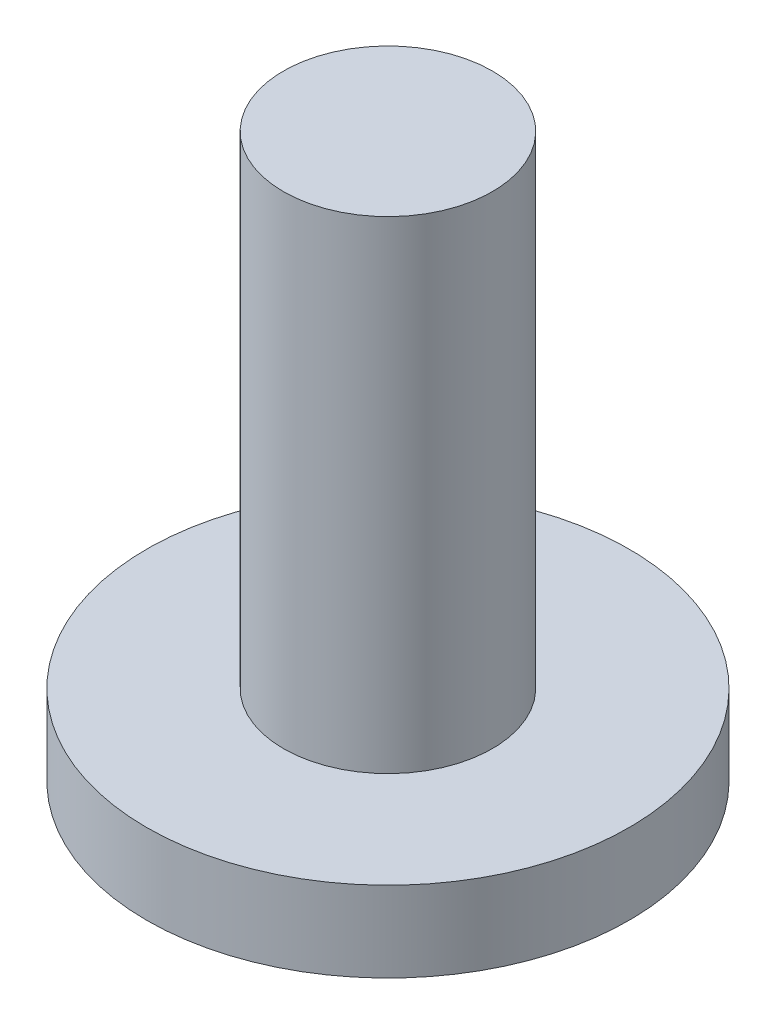
ISO-10303-21;
HEADER;
FILE_DESCRIPTION(('STEP AP214'),'2;1');
FILE_NAME('part.step','',(''),(''),'','','');
FILE_SCHEMA(('AUTOMOTIVE_DESIGN { 1 0 10303 214 1 1 1 1 }'));
ENDSEC;
DATA;
#1=APPLICATION_CONTEXT('core data for automotive mechanical design processes');
#2=APPLICATION_PROTOCOL_DEFINITION('international standard','automotive_design',2000,#1);
#3=PRODUCT_CONTEXT('',#1,'mechanical');
#4=PRODUCT('Part','Part','',(#3));
#5=PRODUCT_RELATED_PRODUCT_CATEGORY('part','',(#4));
#6=PRODUCT_DEFINITION_FORMATION('','',#4);
#7=PRODUCT_DEFINITION_CONTEXT('part definition',#1,'design');
#8=PRODUCT_DEFINITION('design','',#6,#7);
#9=PRODUCT_DEFINITION_SHAPE('','',#8);
#10=(LENGTH_UNIT() NAMED_UNIT(*) SI_UNIT(.MILLI.,.METRE.));
#11=(NAMED_UNIT(*) PLANE_ANGLE_UNIT() SI_UNIT($,.RADIAN.));
#12=(NAMED_UNIT(*) SI_UNIT($,.STERADIAN.) SOLID_ANGLE_UNIT());
#13=UNCERTAINTY_MEASURE_WITH_UNIT(LENGTH_MEASURE(1.E-05),#10,'distance_accuracy_value','');
#14=(GEOMETRIC_REPRESENTATION_CONTEXT(3) GLOBAL_UNCERTAINTY_ASSIGNED_CONTEXT((#13)) GLOBAL_UNIT_ASSIGNED_CONTEXT((#10,
#11,#12)) REPRESENTATION_CONTEXT('',''));
#15=CARTESIAN_POINT('',(0.,0.,0.));
#16=DIRECTION('',(0.,0.,1.));
#17=DIRECTION('',(1.,0.,0.));
#18=AXIS2_PLACEMENT_3D('',#15,#16,#17);
#19=CARTESIAN_POINT('',(0.,1.,0.));
#20=DIRECTION('',(0.,-1.,0.));
#21=DIRECTION('',(0.,0.,-1.));
#22=AXIS2_PLACEMENT_3D('',#19,#20,#21);
#23=CYLINDRICAL_SURFACE('',#22,3.);
#24=CARTESIAN_POINT('',(0.,1.,0.));
#25=DIRECTION('',(0.,1.,0.));
#26=DIRECTION('',(0.,0.,1.));
#27=AXIS2_PLACEMENT_3D('',#24,#25,#26);
#28=CIRCLE('',#27,3.);
#29=CARTESIAN_POINT('',(0.,1.,3.));
#30=VERTEX_POINT('',#29);
#31=EDGE_CURVE('E10',#30,#30,#28,.T.);
#32=ORIENTED_EDGE('',*,*,#31,.F.);
#33=EDGE_LOOP('',(#32));
#34=FACE_BOUND('',#33,.T.);
#35=CARTESIAN_POINT('',(0.,0.,0.));
#36=DIRECTION('',(0.,1.,0.));
#37=DIRECTION('',(0.,0.,1.));
#38=AXIS2_PLACEMENT_3D('',#35,#36,#37);
#39=CIRCLE('',#38,3.);
#40=CARTESIAN_POINT('',(0.,0.,3.));
#41=VERTEX_POINT('',#40);
#42=EDGE_CURVE('E34',#41,#41,#39,.T.);
#43=ORIENTED_EDGE('',*,*,#42,.T.);
#44=EDGE_LOOP('',(#43));
#45=FACE_BOUND('',#44,.T.);
#46=ADVANCED_FACE('F31',(#34,#45),#23,.T.);
#47=CARTESIAN_POINT('',(0.,1.,0.));
#48=DIRECTION('',(0.,1.,0.));
#49=DIRECTION('',(0.,0.,1.));
#50=AXIS2_PLACEMENT_3D('',#47,#48,#49);
#51=PLANE('',#50);
#52=CARTESIAN_POINT('',(0.,1.,0.));
#53=DIRECTION('',(0.,1.,0.));
#54=DIRECTION('',(0.,0.,1.));
#55=AXIS2_PLACEMENT_3D('',#52,#53,#54);
#56=CIRCLE('',#55,1.3);
#57=CARTESIAN_POINT('',(0.,1.,1.3));
#58=VERTEX_POINT('',#57);
#59=EDGE_CURVE('E43',#58,#58,#56,.T.);
#60=ORIENTED_EDGE('',*,*,#59,.F.);
#61=EDGE_LOOP('',(#60));
#62=FACE_BOUND('',#61,.T.);
#63=ORIENTED_EDGE('',*,*,#31,.T.);
#64=EDGE_LOOP('',(#63));
#65=FACE_BOUND('',#64,.T.);
#66=ADVANCED_FACE('F58',(#62,#65),#51,.T.);
#67=CARTESIAN_POINT('',(0.,0.,0.));
#68=DIRECTION('',(0.,1.,0.));
#69=DIRECTION('',(0.,0.,1.));
#70=AXIS2_PLACEMENT_3D('',#67,#68,#69);
#71=PLANE('',#70);
#72=ORIENTED_EDGE('',*,*,#42,.F.);
#73=EDGE_LOOP('',(#72));
#74=FACE_BOUND('',#73,.T.);
#75=ADVANCED_FACE('F54',(#74),#71,.F.);
#76=CARTESIAN_POINT('',(0.,7.,0.));
#77=DIRECTION('',(0.,-1.,0.));
#78=DIRECTION('',(0.,0.,-1.));
#79=AXIS2_PLACEMENT_3D('',#76,#77,#78);
#80=CYLINDRICAL_SURFACE('',#79,1.3);
#81=CARTESIAN_POINT('',(0.,7.,0.));
#82=DIRECTION('',(0.,1.,0.));
#83=DIRECTION('',(0.,0.,1.));
#84=AXIS2_PLACEMENT_3D('',#81,#82,#83);
#85=CIRCLE('',#84,1.3);
#86=CARTESIAN_POINT('',(0.,7.,1.3));
#87=VERTEX_POINT('',#86);
#88=EDGE_CURVE('E41',#87,#87,#85,.T.);
#89=ORIENTED_EDGE('',*,*,#88,.F.);
#90=EDGE_LOOP('',(#89));
#91=FACE_BOUND('',#90,.T.);
#92=ORIENTED_EDGE('',*,*,#59,.T.);
#93=EDGE_LOOP('',(#92));
#94=FACE_BOUND('',#93,.T.);
#95=ADVANCED_FACE('F51',(#91,#94),#80,.T.);
#96=CARTESIAN_POINT('',(0.,7.,0.));
#97=DIRECTION('',(0.,1.,0.));
#98=DIRECTION('',(0.,0.,1.));
#99=AXIS2_PLACEMENT_3D('',#96,#97,#98);
#100=PLANE('',#99);
#101=ORIENTED_EDGE('',*,*,#88,.T.);
#102=EDGE_LOOP('',(#101));
#103=FACE_BOUND('',#102,.T.);
#104=ADVANCED_FACE('F49',(#103),#100,.T.);
#105=CLOSED_SHELL('',(#46,#66,#75,#95,#104));
#106=MANIFOLD_SOLID_BREP('B2',#105);
#107=ADVANCED_BREP_SHAPE_REPRESENTATION('',(#18,#106),#14);
#108=SHAPE_DEFINITION_REPRESENTATION(#9,#107);
ENDSEC;
END-ISO-10303-21;
